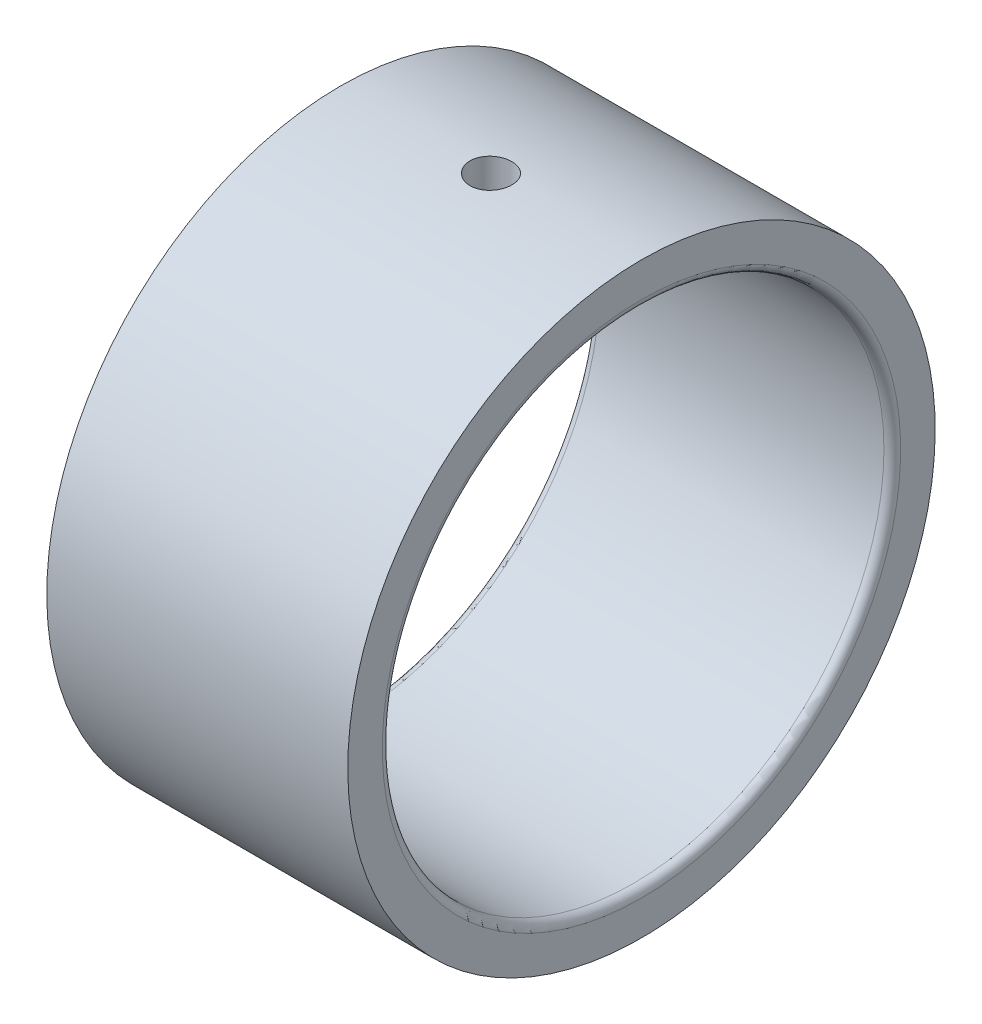
ISO-10303-21;
HEADER;
FILE_DESCRIPTION(('STEP AP214'),'2;1');
FILE_NAME('part.step','',(''),(''),'','','');
FILE_SCHEMA(('AUTOMOTIVE_DESIGN { 1 0 10303 214 1 1 1 1 }'));
ENDSEC;
DATA;
#1=APPLICATION_CONTEXT('core data for automotive mechanical design processes');
#2=APPLICATION_PROTOCOL_DEFINITION('international standard','automotive_design',2000,#1);
#3=PRODUCT_CONTEXT('',#1,'mechanical');
#4=PRODUCT('Part','Part','',(#3));
#5=PRODUCT_RELATED_PRODUCT_CATEGORY('part','',(#4));
#6=PRODUCT_DEFINITION_FORMATION('','',#4);
#7=PRODUCT_DEFINITION_CONTEXT('part definition',#1,'design');
#8=PRODUCT_DEFINITION('design','',#6,#7);
#9=PRODUCT_DEFINITION_SHAPE('','',#8);
#10=(LENGTH_UNIT() NAMED_UNIT(*) SI_UNIT(.MILLI.,.METRE.));
#11=(NAMED_UNIT(*) PLANE_ANGLE_UNIT() SI_UNIT($,.RADIAN.));
#12=(NAMED_UNIT(*) SI_UNIT($,.STERADIAN.) SOLID_ANGLE_UNIT());
#13=UNCERTAINTY_MEASURE_WITH_UNIT(LENGTH_MEASURE(1.E-05),#10,'distance_accuracy_value','');
#14=(GEOMETRIC_REPRESENTATION_CONTEXT(3) GLOBAL_UNCERTAINTY_ASSIGNED_CONTEXT((#13)) GLOBAL_UNIT_ASSIGNED_CONTEXT((#10,
#11,#12)) REPRESENTATION_CONTEXT('',''));
#15=CARTESIAN_POINT('',(0.,0.,0.));
#16=DIRECTION('',(0.,0.,1.));
#17=DIRECTION('',(1.,0.,0.));
#18=AXIS2_PLACEMENT_3D('',#15,#16,#17);
#19=CARTESIAN_POINT('',(23.,16.5325,0.));
#20=DIRECTION('',(1.,0.,0.));
#21=DIRECTION('',(0.,1.,0.));
#22=AXIS2_PLACEMENT_3D('',#19,#20,#21);
#23=PLANE('',#22);
#24=CARTESIAN_POINT('',(23.,0.,0.));
#25=DIRECTION('',(1.,0.,0.));
#26=DIRECTION('',(0.,1.,0.));
#27=AXIS2_PLACEMENT_3D('',#24,#25,#26);
#28=CIRCLE('',#27,17.565);
#29=CARTESIAN_POINT('',(23.,17.565,0.));
#30=VERTEX_POINT('',#29);
#31=EDGE_CURVE('E11',#30,#30,#28,.T.);
#32=ORIENTED_EDGE('',*,*,#31,.T.);
#33=EDGE_LOOP('',(#32));
#34=FACE_BOUND('',#33,.T.);
#35=CARTESIAN_POINT('',(23.,0.,0.));
#36=DIRECTION('',(1.,0.,0.));
#37=DIRECTION('',(0.,1.,0.));
#38=AXIS2_PLACEMENT_3D('',#35,#36,#37);
#39=CIRCLE('',#38,15.5);
#40=CARTESIAN_POINT('',(23.,15.5,0.));
#41=VERTEX_POINT('',#40);
#42=EDGE_CURVE('E58',#41,#41,#39,.T.);
#43=ORIENTED_EDGE('',*,*,#42,.F.);
#44=EDGE_LOOP('',(#43));
#45=FACE_BOUND('',#44,.T.);
#46=ADVANCED_FACE('F17',(#34,#45),#23,.T.);
#47=CARTESIAN_POINT('',(14.,0.,0.));
#48=DIRECTION('',(-1.,0.,0.));
#49=DIRECTION('',(0.,1.,0.));
#50=AXIS2_PLACEMENT_3D('',#47,#48,#49);
#51=CYLINDRICAL_SURFACE('',#50,17.565);
#52=CARTESIAN_POINT('',(5.,0.,0.));
#53=DIRECTION('',(1.,0.,0.));
#54=DIRECTION('',(0.,1.,0.));
#55=AXIS2_PLACEMENT_3D('',#52,#53,#54);
#56=CIRCLE('',#55,17.565);
#57=CARTESIAN_POINT('',(5.,17.565,0.));
#58=VERTEX_POINT('',#57);
#59=EDGE_CURVE('E30',#58,#58,#56,.T.);
#60=ORIENTED_EDGE('',*,*,#59,.T.);
#61=EDGE_LOOP('',(#60));
#62=FACE_BOUND('',#61,.T.);
#63=ORIENTED_EDGE('',*,*,#31,.F.);
#64=EDGE_LOOP('',(#63));
#65=FACE_BOUND('',#64,.T.);
#66=CARTESIAN_POINT('',(14.,17.5204658899243,1.24999999999996));
#67=CARTESIAN_POINT('',(13.9800089146342,17.520466301846,1.249993015171));
#68=CARTESIAN_POINT('',(13.9600187753889,17.5205022222585,1.24949071877739));
#69=CARTESIAN_POINT('',(13.9200070072349,17.5206435497487,1.24750807806131));
#70=CARTESIAN_POINT('',(13.8999855722453,17.5207492342176,1.24602382931405));
#71=CARTESIAN_POINT('',(13.8599113937337,17.5210294170264,1.2420776466169));
#72=CARTESIAN_POINT('',(13.8398592619771,17.5212043490581,1.23960955021257));
#73=CARTESIAN_POINT('',(13.7997233084123,17.5216215606517,1.23369840935388));
#74=CARTESIAN_POINT('',(13.7796407112833,17.5218644093639,1.23024712086131));
#75=CARTESIAN_POINT('',(13.739062522209,17.5224208541123,1.22229653610312));
#76=CARTESIAN_POINT('',(13.7185724710935,17.5227363437584,1.2177690591333));
#77=CARTESIAN_POINT('',(13.6780218017482,17.5234296476709,1.20775135998248));
#78=CARTESIAN_POINT('',(13.6579589886251,17.5238068864202,1.20227000093838));
#79=CARTESIAN_POINT('',(13.6182628873823,17.5246208298438,1.19034668784258));
#80=CARTESIAN_POINT('',(13.5986276635403,17.525057135288,1.18391115735987));
#81=CARTESIAN_POINT('',(13.5597862357427,17.5259858674348,1.17008213534265));
#82=CARTESIAN_POINT('',(13.5405786410135,17.526478065106,1.16269253739206));
#83=CARTESIAN_POINT('',(13.5025819532017,17.5275151689108,1.14695209969282));
#84=CARTESIAN_POINT('',(13.4837925194683,17.5280600300527,1.13860207931536));
#85=CARTESIAN_POINT('',(13.4465749671596,17.5291993963804,1.12092475371521));
#86=CARTESIAN_POINT('',(13.4281489059477,17.5297941182098,1.11159313349693));
#87=CARTESIAN_POINT('',(13.3916566091563,17.5310284000238,1.0919549938721));
#88=CARTESIAN_POINT('',(13.3735938588682,17.5316682484772,1.0816420208227));
#89=CARTESIAN_POINT('',(13.3378268938344,17.5329875438803,1.06004287022596));
#90=CARTESIAN_POINT('',(13.3201277224469,17.533667309547,1.04874837011251));
#91=CARTESIAN_POINT('',(13.2857941020258,17.5350326096038,1.02566385640195));
#92=CARTESIAN_POINT('',(13.2691436662075,17.5357174107756,1.01389756469167));
#93=CARTESIAN_POINT('',(13.2365764982019,17.5371001081785,0.989692037974546));
#94=CARTESIAN_POINT('',(13.2206544286263,17.5377978261774,0.977259982887079));
#95=CARTESIAN_POINT('',(13.1895435133486,17.5392020214601,0.951724645624603));
#96=CARTESIAN_POINT('',(13.1743503326084,17.5399084038689,0.938626642520315));
#97=CARTESIAN_POINT('',(13.1446957462063,17.5413253827599,0.911761428102619));
#98=CARTESIAN_POINT('',(13.1302312732844,17.5420359445002,0.897997602473691));
#99=CARTESIAN_POINT('',(13.1020125424039,17.5434576665171,0.869780118696981));
#100=CARTESIAN_POINT('',(13.0882577792327,17.5441688259912,0.855326965760072));
#101=CARTESIAN_POINT('',(13.0614044838503,17.545588793772,0.825687665915485));
#102=CARTESIAN_POINT('',(13.0483096926966,17.546297571149,0.810498129870093));
#103=CARTESIAN_POINT('',(13.0227743265952,17.5477071013984,0.779387418373633));
#104=CARTESIAN_POINT('',(13.0103393915431,17.5484077542909,0.763461611997861));
#105=CARTESIAN_POINT('',(12.9861213573174,17.5497950944619,0.730879986145946));
#106=CARTESIAN_POINT('',(12.9743457930942,17.5504815790485,0.714218564183063));
#107=CARTESIAN_POINT('',(12.9512598341399,17.5518455897751,0.679886012734962));
#108=CARTESIAN_POINT('',(12.9399720291957,17.5525223128224,0.662199652814072));
#109=CARTESIAN_POINT('',(12.9183815009633,17.5538344170415,0.626449711092376));
#110=CARTESIAN_POINT('',(12.9080708557196,17.5544701143763,0.608390930709203));
#111=CARTESIAN_POINT('',(12.8884324143112,17.5556967493197,0.571898363546964));
#112=CARTESIAN_POINT('',(12.879098588526,17.5562879543055,0.553467832620349));
#113=CARTESIAN_POINT('',(12.8614115616356,17.5574221785125,0.516233394130617));
#114=CARTESIAN_POINT('',(12.8530544826761,17.5579653860375,0.497431335469938));
#115=CARTESIAN_POINT('',(12.8373116760529,17.5590007198477,0.459434129595488));
#116=CARTESIAN_POINT('',(12.8299254804073,17.5594928707188,0.440239176958119));
#117=CARTESIAN_POINT('',(12.8161007823937,17.5604234024573,0.401414535858721));
#118=CARTESIAN_POINT('',(12.8096665999717,17.5608615368014,0.381783304311059));
#119=CARTESIAN_POINT('',(12.7977429179005,17.5616798241945,0.342087101088755));
#120=CARTESIAN_POINT('',(12.792260254934,17.562059555567,0.322020069355993));
#121=CARTESIAN_POINT('',(12.7822373766536,17.5627567486462,0.281452904589832));
#122=CARTESIAN_POINT('',(12.7777064208934,17.5630735970349,0.260950478139567));
#123=CARTESIAN_POINT('',(12.7697451193843,17.5636294234586,0.22033451523269));
#124=CARTESIAN_POINT('',(12.7662872555337,17.5638703514381,0.200226393044502));
#125=CARTESIAN_POINT('',(12.7603679452518,17.5642821275545,0.160056065129138));
#126=CARTESIAN_POINT('',(12.7578974278249,17.564453613872,0.139995208183642));
#127=CARTESIAN_POINT('',(12.7539511149658,17.5647271394141,0.0999206600752436));
#128=CARTESIAN_POINT('',(12.7524683017481,17.5648296686409,0.079907665211727));
#129=CARTESIAN_POINT('',(12.7504950747756,17.5649659333044,0.0399296208034422));
#130=CARTESIAN_POINT('',(12.7499998824952,17.5649999999978,0.0199648095195712));
#131=CARTESIAN_POINT('',(12.7500001174694,17.5650000000022,-0.0199588018962388));
#132=CARTESIAN_POINT('',(12.7504952466809,17.5649659538122,-0.0399176020292395));
#133=CARTESIAN_POINT('',(12.7524683281529,17.5648297574541,-0.0798876360126819));
#134=CARTESIAN_POINT('',(12.7539512567502,17.5647272624479,-0.0998986217190281));
#135=CARTESIAN_POINT('',(12.7578976770498,17.564453792032,-0.139973143296073));
#136=CARTESIAN_POINT('',(12.7603683768427,17.5642823131658,-0.160035963793074));
#137=CARTESIAN_POINT('',(12.7662873905096,17.5638704956513,-0.200214336519088));
#138=CARTESIAN_POINT('',(12.7697449493132,17.5636295055822,-0.220328514510191));
#139=CARTESIAN_POINT('',(12.7777030539385,17.5630737598698,-0.260938578970886));
#140=CARTESIAN_POINT('',(12.7822302802459,17.562757114416,-0.281429218173477));
#141=CARTESIAN_POINT('',(12.7922481376375,17.5620602732342,-0.321980689153653));
#142=CARTESIAN_POINT('',(12.7977298901683,17.5616806645832,-0.342043719709662));
#143=CARTESIAN_POINT('',(12.8096537468708,17.5608624855571,-0.381739868853653));
#144=CARTESIAN_POINT('',(12.8160894085632,17.5604243125261,-0.40137492903844));
#145=CARTESIAN_POINT('',(12.8299184207387,17.5594934775066,-0.440215486387578));
#146=CARTESIAN_POINT('',(12.8373078477928,17.559001039893,-0.459422384860624));
#147=CARTESIAN_POINT('',(12.8530488825843,17.5579656861014,-0.4974203219267));
#148=CARTESIAN_POINT('',(12.8613997998414,17.5574228062012,-0.516211647538775));
#149=CARTESIAN_POINT('',(12.8790786188817,17.5562890871765,-0.553431786612573));
#150=CARTESIAN_POINT('',(12.8884107787566,17.5556980417594,-0.571858570080041));
#151=CARTESIAN_POINT('',(12.9080493968001,17.5544715003397,-0.608351047569516));
#152=CARTESIAN_POINT('',(12.918362246682,17.5538357209052,-0.626413289815878));
#153=CARTESIAN_POINT('',(12.9399602726176,17.5525231438912,-0.662177912198753));
#154=CARTESIAN_POINT('',(12.9512537054419,17.551846015868,-0.679875288324914));
#155=CARTESIAN_POINT('',(12.9743383743283,17.5504819552277,-0.714209095182545));
#156=CARTESIAN_POINT('',(12.9861060680005,17.5497958597567,-0.730861396020406));
#157=CARTESIAN_POINT('',(13.0103136223668,17.5484090894612,-0.763430866135088));
#158=CARTESIAN_POINT('',(13.0227462436235,17.5477086086603,-0.779353417768006));
#159=CARTESIAN_POINT('',(13.0482817566078,17.5462991498696,-0.810464010784431));
#160=CARTESIAN_POINT('',(13.061379309318,17.5455902665067,-0.825656436467267));
#161=CARTESIAN_POINT('',(13.0882424907588,17.5441697395448,-0.855308382492613));
#162=CARTESIAN_POINT('',(13.1020046742961,17.5434581247677,-0.869771023746323));
#163=CARTESIAN_POINT('',(13.1302221767156,17.5420363409971,-0.897989732908215));
#164=CARTESIAN_POINT('',(13.1446771596884,17.5413261714735,-0.911746136672221));
#165=CARTESIAN_POINT('',(13.1743191000033,17.5399097497178,-0.938601464868672));
#166=CARTESIAN_POINT('',(13.1895093928041,17.5392035355236,-0.951696707836842));
#167=CARTESIAN_POINT('',(13.2206204299002,17.537799392767,-0.977231900959588));
#168=CARTESIAN_POINT('',(13.2365457558611,17.5371015644926,-0.989666271164133));
#169=CARTESIAN_POINT('',(13.2691250795189,17.5357182997025,-1.01388227790413));
#170=CARTESIAN_POINT('',(13.2857846347206,17.5350330482933,-1.02565643891281));
#171=CARTESIAN_POINT('',(13.3201169956888,17.5336676721139,-1.04874223995048));
#172=CARTESIAN_POINT('',(13.3378051486998,17.532988250975,-1.06003111079908));
#173=CARTESIAN_POINT('',(13.373557432598,17.531669435822,-1.0816227631636));
#174=CARTESIAN_POINT('',(13.3916167226445,17.5310297356258,-1.09193353244419));
#175=CARTESIAN_POINT('',(13.4281091125009,17.529795491231,-1.1115714972713));
#176=CARTESIAN_POINT('',(13.4465389229626,17.5292006747425,-1.12090478434916));
#177=CARTESIAN_POINT('',(13.4837707751675,17.5280607967688,-1.13859031839306));
#178=CARTESIAN_POINT('',(13.5025709406967,17.5275155378474,-1.14694650007027));
#179=CARTESIAN_POINT('',(13.5405668949237,17.5264783173799,-1.16268870871728));
#180=CARTESIAN_POINT('',(13.5597625425983,17.5259863372139,-1.170075074812));
#181=CARTESIAN_POINT('',(13.5985880544976,17.5250579035839,-1.18389978288564));
#182=CARTESIAN_POINT('',(13.6182194512878,17.52462170253,-1.19033383479579));
#183=CARTESIAN_POINT('',(13.6579156087655,17.5238077804959,-1.20225697332903));
#184=CARTESIAN_POINT('',(13.6779824236363,17.5234304832498,-1.20773924211751));
#185=CARTESIAN_POINT('',(13.7185487876742,17.5227368378369,-1.21776196484662));
#186=CARTESIAN_POINT('',(13.7390506263045,17.5224210898321,-1.22229317495197));
#187=CARTESIAN_POINT('',(13.77963470834,17.521864421253,-1.23024694433581));
#188=CARTESIAN_POINT('',(13.7997112439371,17.5216215508487,-1.23369852304446));
#189=CARTESIAN_POINT('',(13.8398391693481,17.5212043199215,-1.23960998801517));
#190=CARTESIAN_POINT('',(13.8598893599279,17.521029402322,-1.24207794255419));
#191=CARTESIAN_POINT('',(13.899963505796,17.5207492226495,-1.24602390395184));
#192=CARTESIAN_POINT('',(13.9199868690026,17.5206435403209,-1.24750788417871));
#193=CARTESIAN_POINT('',(13.9600068677542,17.5205022185822,-1.24949109525479));
#194=CARTESIAN_POINT('',(13.9800033177053,17.5204663156298,-1.24999403133116));
#195=CARTESIAN_POINT('',(14.0199247421255,17.5204654657503,-1.25000594719611));
#196=CARTESIAN_POINT('',(14.0398497149258,17.520500264016,-1.24951849633765));
#197=CARTESIAN_POINT('',(14.0797744850562,17.5206401617727,-1.24755532316586));
#198=CARTESIAN_POINT('',(14.0997739783732,17.5207456966074,-1.2460734808653));
#199=CARTESIAN_POINT('',(14.1398481977649,17.5210259601027,-1.24212650289831));
#200=CARTESIAN_POINT('',(14.1599220957016,17.5212012750152,-1.2396530348589));
#201=CARTESIAN_POINT('',(14.2001457189041,17.5216196498218,-1.23372555122565));
#202=CARTESIAN_POINT('',(14.2202939063651,17.521863423645,-1.23026119462141));
#203=CARTESIAN_POINT('',(14.2609372383137,17.5224209423229,-1.22229528637929));
#204=CARTESIAN_POINT('',(14.2814274650319,17.522736367292,-1.21776872572151));
#205=CARTESIAN_POINT('',(14.3219782616054,17.5234296243463,-1.20775169043216));
#206=CARTESIAN_POINT('',(14.34204102832,17.5238068801905,-1.20227008919656));
#207=CARTESIAN_POINT('',(14.381737095842,17.5246208360347,-1.1903466001331));
#208=CARTESIAN_POINT('',(14.4013723319923,17.5250571369442,-1.18391113389543));
#209=CARTESIAN_POINT('',(14.4402137687507,17.5259858657861,-1.1700821586994));
#210=CARTESIAN_POINT('',(14.459421360194,17.5264780646645,-1.16269254364759));
#211=CARTESIAN_POINT('',(14.4974180456044,17.5275151693523,-1.1469520934373));
#212=CARTESIAN_POINT('',(14.5162074802183,17.5280600301716,-1.13860207763103));
#213=CARTESIAN_POINT('',(14.5534250331778,17.5291993962618,-1.12092475539436));
#214=CARTESIAN_POINT('',(14.5718510941548,17.5297941181783,-1.11159313394187));
#215=CARTESIAN_POINT('',(14.6083433907717,17.5310284000566,-1.09195499340653));
#216=CARTESIAN_POINT('',(14.6264061411225,17.5316682484864,-1.08164202069209));
#217=CARTESIAN_POINT('',(14.6621731061979,17.5329875438718,-1.06004287034528));
#218=CARTESIAN_POINT('',(14.6798722775636,17.5336673095449,-1.0487483701429));
#219=CARTESIAN_POINT('',(14.7142058979727,17.5350326096063,-1.02566385636691));
#220=CARTESIAN_POINT('',(14.7308563337997,17.5357174107766,-1.0138975646764));
#221=CARTESIAN_POINT('',(14.7634235018145,17.5371001081786,-0.98969203797142));
#222=CARTESIAN_POINT('',(14.7793455713904,17.537797826178,-0.977259982876728));
#223=CARTESIAN_POINT('',(14.8104564866673,17.5392020214609,-0.951724645609818));
#224=CARTESIAN_POINT('',(14.8256496674065,17.5399084038696,-0.938626642508405));
#225=CARTESIAN_POINT('',(14.8553042538027,17.5413253827602,-0.911761428096319));
#226=CARTESIAN_POINT('',(14.86976872672,17.5420359445004,-0.897997602470273));
#227=CARTESIAN_POINT('',(14.8979874575997,17.5434576665173,-0.869780118692287));
#228=CARTESIAN_POINT('',(14.9117422207744,17.5441688259917,-0.855326965750821));
#229=CARTESIAN_POINT('',(14.9385955161615,17.5455887937728,-0.825687665900112));
#230=CARTESIAN_POINT('',(14.9516903073164,17.5462975711498,-0.810498129853283));
#231=CARTESIAN_POINT('',(14.9772256734179,17.5477071013991,-0.779387418356844));
#232=CARTESIAN_POINT('',(14.9896606084689,17.5484077542916,-0.763461611982648));
#233=CARTESIAN_POINT('',(15.0138786426898,17.5497950944623,-0.730879986136753));
#234=CARTESIAN_POINT('',(15.0256542069093,17.5504815790487,-0.714218564178422));
#235=CARTESIAN_POINT('',(15.0487401658587,17.5518455897751,-0.679886012736097));
#236=CARTESIAN_POINT('',(15.0600279708016,17.5525223128223,-0.66219965281632));
#237=CARTESIAN_POINT('',(15.0816184990321,17.5538344170413,-0.626449711096166));
#238=CARTESIAN_POINT('',(15.0919291442754,17.5544701143762,-0.608390930713389));
#239=CARTESIAN_POINT('',(15.1115675856837,17.5556967493195,-0.571898363551144));
#240=CARTESIAN_POINT('',(15.1209014114693,17.5562879543054,-0.553467832624101));
#241=CARTESIAN_POINT('',(15.1385884383616,17.5574221785124,-0.516233394132873));
#242=CARTESIAN_POINT('',(15.1469455173226,17.5579653860375,-0.497431335471102));
#243=CARTESIAN_POINT('',(15.1626883239451,17.5590007198475,-0.459434129602148));
#244=CARTESIAN_POINT('',(15.1700745195889,17.5594928707184,-0.440239176971535));
#245=CARTESIAN_POINT('',(15.1838992176,17.5604234024567,-0.401414535881153));
#246=CARTESIAN_POINT('',(15.1903334000212,17.5608615368008,-0.381783304335673));
#247=CARTESIAN_POINT('',(15.2022570820923,17.561679824194,-0.342087101113343));
#248=CARTESIAN_POINT('',(15.2077397450593,17.5620595555666,-0.322020069378306));
#249=CARTESIAN_POINT('',(15.2177626233425,17.562756748646,-0.281452904603234));
#250=CARTESIAN_POINT('',(15.2222935791048,17.5630735970348,-0.260950478146278));
#251=CARTESIAN_POINT('',(15.2302548806156,17.5636294234586,-0.220334515235786));
#252=CARTESIAN_POINT('',(15.2337127444664,17.563870351438,-0.200226393050764));
#253=CARTESIAN_POINT('',(15.2396320547484,17.5642821275544,-0.160056065139615));
#254=CARTESIAN_POINT('',(15.2421025721752,17.5644536138719,-0.139995208195154));
#255=CARTESIAN_POINT('',(15.2460488850343,17.564727139414,-0.0999206600867824));
#256=CARTESIAN_POINT('',(15.2475316982519,17.5648296686408,-0.0799076652222485));
#257=CARTESIAN_POINT('',(15.2495049252244,17.5649659333043,-0.0399296208098309));
#258=CARTESIAN_POINT('',(15.2500001175048,17.5649999999978,-0.0199648095228393));
#259=CARTESIAN_POINT('',(15.2499998825306,17.5650000000022,0.019958801899784));
#260=CARTESIAN_POINT('',(15.2495047533192,17.5649659538121,0.0399176020364772));
#261=CARTESIAN_POINT('',(15.2475316718471,17.5648297574541,0.0798876360248588));
#262=CARTESIAN_POINT('',(15.2460487432499,17.5647272624478,0.0998986217324575));
#263=CARTESIAN_POINT('',(15.2421023229503,17.5644537920319,0.139973143309554));
#264=CARTESIAN_POINT('',(15.2396316231576,17.5642823131657,0.160035963805366));
#265=CARTESIAN_POINT('',(15.2337126094905,17.5638704956512,0.200214336526486));
#266=CARTESIAN_POINT('',(15.2302550506867,17.5636295055822,0.220328514513899));
#267=CARTESIAN_POINT('',(15.2222969460598,17.5630737598697,0.260938578976082));
#268=CARTESIAN_POINT('',(15.2177697197505,17.5627571144159,0.281429218183766));
#269=CARTESIAN_POINT('',(15.2077518623565,17.5620602732339,0.321980689170715));
#270=CARTESIAN_POINT('',(15.2022701098252,17.5616806645829,0.342043719728446));
#271=CARTESIAN_POINT('',(15.1903462531228,17.5608624855567,0.381739868872447));
#272=CARTESIAN_POINT('',(15.1839105914311,17.5604243125257,0.401374929055574));
#273=CARTESIAN_POINT('',(15.1700815792578,17.5594934775064,0.440215486397875));
#274=CARTESIAN_POINT('',(15.1626921522054,17.5590010398929,0.459422384865808));
#275=CARTESIAN_POINT('',(15.1469511174163,17.5579656861014,0.497420321924219));
#276=CARTESIAN_POINT('',(15.1386002001598,17.5574228062013,0.516211647533688));
#277=CARTESIAN_POINT('',(15.1209213811204,17.5562890871767,0.553431786604063));
#278=CARTESIAN_POINT('',(15.1115892212457,17.5556980417597,0.571858570070675));
#279=CARTESIAN_POINT('',(15.0919506032021,17.5544715003401,0.608351047560133));
#280=CARTESIAN_POINT('',(15.08163775332,17.5538357209055,0.626413289807291));
#281=CARTESIAN_POINT('',(15.0600397273836,17.5525231438914,0.662177912193618));
#282=CARTESIAN_POINT('',(15.0487462945588,17.5518460158681,0.679875288322396));
#283=CARTESIAN_POINT('',(15.0256616256736,17.5504819552278,0.714209095181179));
#284=CARTESIAN_POINT('',(15.0138939320036,17.5497958597568,0.730861396017702));
#285=CARTESIAN_POINT('',(14.98968637764,17.5484090894614,0.763430866130535));
#286=CARTESIAN_POINT('',(14.9772537563838,17.5477086086605,0.779353417762905));
#287=CARTESIAN_POINT('',(14.9517182433995,17.5462991498698,0.810464010779312));
#288=CARTESIAN_POINT('',(14.9386206906886,17.5455902665069,0.825656436462632));
#289=CARTESIAN_POINT('',(14.9117575092452,17.5441697395449,0.855308382489725));
#290=CARTESIAN_POINT('',(14.8979953257058,17.5434581247678,0.869771023744646));
#291=CARTESIAN_POINT('',(14.8697778232813,17.542036340997,0.897989732910864));
#292=CARTESIAN_POINT('',(14.8553228403053,17.5413261714732,0.911746136677924));
#293=CARTESIAN_POINT('',(14.825680899986,17.5399097497174,0.938601464876662));
#294=CARTESIAN_POINT('',(14.8104906071838,17.5392035355233,0.951696707844156));
#295=CARTESIAN_POINT('',(14.7793795700886,17.5377993927663,0.977231900971373));
#296=CARTESIAN_POINT('',(14.76345424413,17.5371015644915,0.989666271181225));
#297=CARTESIAN_POINT('',(14.7308749204732,17.5357182997028,1.01388227790088));
#298=CARTESIAN_POINT('',(14.7142153652702,17.5350330482954,1.02565643888374));
#299=CARTESIAN_POINT('',(14.6798830043106,17.5336676721114,1.04874223998693));
#300=CARTESIAN_POINT('',(14.6621948513098,17.532988250966,1.06003111092955));
#301=CARTESIAN_POINT('',(14.6264425673561,17.5316694358297,1.08162276305598));
#302=CARTESIAN_POINT('',(14.6083832772449,17.5310297356564,1.09193353200847));
#303=CARTESIAN_POINT('',(14.5718908875591,17.5297954911988,1.11157149773428));
#304=CARTESIAN_POINT('',(14.5534610773309,17.5292006746254,1.1209047860288));
#305=CARTESIAN_POINT('',(14.5162292245041,17.528060796884,1.13859031674276));
#306=CARTESIAN_POINT('',(14.497429058124,17.5275155382782,1.14694649389766));
#307=CARTESIAN_POINT('',(14.4594331062494,17.526478316949,1.16268871489024));
#308=CARTESIAN_POINT('',(14.4402374617764,17.5259863356063,1.17007509784506));
#309=CARTESIAN_POINT('',(14.4014119411139,17.5250579051992,1.18389975974194));
#310=CARTESIAN_POINT('',(14.3817805322923,17.5246217085693,1.19033374826522));
#311=CARTESIAN_POINT('',(14.3420844077751,17.523807774416,1.20225706044252));
#312=CARTESIAN_POINT('',(14.3220176382895,17.5234304604819,1.20773956833525));
#313=CARTESIAN_POINT('',(14.2814511498289,17.5227368608174,1.2177616355815));
#314=CARTESIAN_POINT('',(14.2609491393831,17.522421175987,1.22229194052392));
#315=CARTESIAN_POINT('',(14.2202999035013,17.5218634373714,1.23026100553438));
#316=CARTESIAN_POINT('',(14.2001577627921,17.5216196471619,1.23372561325674));
#317=CARTESIAN_POINT('',(14.1599422078175,17.5212012367275,1.23965355322462));
#318=CARTESIAN_POINT('',(14.1398703057418,17.5210259147239,1.24212705126935));
#319=CARTESIAN_POINT('',(14.0997959696174,17.5207457125264,1.24607334662653));
#320=CARTESIAN_POINT('',(14.0797943458768,17.5206402586846,1.24755429439939));
#321=CARTESIAN_POINT('',(14.0398618969997,17.520500152507,1.2495197319216));
#322=CARTESIAN_POINT('',(14.0199313625287,17.5204650810555,1.25001012040509));
#323=CARTESIAN_POINT('',(14.,17.5204658899243,1.24999999999996));
#324=B_SPLINE_CURVE_WITH_KNOTS('',3,(#66,#67,#68,#69,#70,#71,#72,#73,#74,#75,#76,#77,#78,#79,
#80,#81,#82,#83,#84,#85,#86,#87,#88,#89,#90,#91,#92,#93,#94,#95,#96,#97,#98,#99,#100,#101,#102,
#103,#104,#105,#106,#107,#108,#109,#110,#111,#112,#113,#114,#115,#116,#117,#118,#119,#120,#121,
#122,#123,#124,#125,#126,#127,#128,#129,#130,#131,#132,#133,#134,#135,#136,#137,#138,#139,#140,
#141,#142,#143,#144,#145,#146,#147,#148,#149,#150,#151,#152,#153,#154,#155,#156,#157,#158,#159,
#160,#161,#162,#163,#164,#165,#166,#167,#168,#169,#170,#171,#172,#173,#174,#175,#176,#177,#178,
#179,#180,#181,#182,#183,#184,#185,#186,#187,#188,#189,#190,#191,#192,#193,#194,#195,#196,#197,
#198,#199,#200,#201,#202,#203,#204,#205,#206,#207,#208,#209,#210,#211,#212,#213,#214,#215,#216,
#217,#218,#219,#220,#221,#222,#223,#224,#225,#226,#227,#228,#229,#230,#231,#232,#233,#234,#235,
#236,#237,#238,#239,#240,#241,#242,#243,#244,#245,#246,#247,#248,#249,#250,#251,#252,#253,#254,
#255,#256,#257,#258,#259,#260,#261,#262,#263,#264,#265,#266,#267,#268,#269,#270,#271,#272,#273,
#274,#275,#276,#277,#278,#279,#280,#281,#282,#283,#284,#285,#286,#287,#288,#289,#290,#291,#292,
#293,#294,#295,#296,#297,#298,#299,#300,#301,#302,#303,#304,#305,#306,#307,#308,#309,#310,#311,
#312,#313,#314,#315,#316,#317,#318,#319,#320,#321,#322,#323),.UNSPECIFIED.,.F.,.F.,(4,2,2,2,2,2,
2,2,2,2,2,2,2,2,2,2,2,2,2,2,2,2,2,2,2,2,2,2,2,2,2,2,2,2,2,2,2,2,2,2,2,2,2,2,2,2,2,2,2,2,2,2,2,2,
2,2,2,2,2,2,2,2,2,2,2,2,2,2,2,2,2,2,2,2,2,2,2,2,2,2,2,2,2,2,2,2,2,2,2,2,2,2,2,2,2,2,2,2,2,2,2,2,
2,2,2,2,2,2,2,2,2,2,2,2,2,2,2,2,2,2,2,2,2,2,2,2,2,2,4),(0.,0.059965998379301,0.120171877363313,
0.180760942894221,0.241873805318166,0.304808916148259,0.367187761058506,0.429164280990093,
0.490895426807696,0.55257429280864,0.61453661937885,0.676939045118618,0.739934925769114,
0.801111966725258,0.861726664406241,0.921919117561016,0.981832387073532,1.0417024011528,
1.10188049497556,1.16250969047629,1.22372984806673,1.28668224173776,1.34907043502638,
1.41104745940872,1.47276940475099,1.53446148912053,1.59642545108307,1.65881768621844,
1.72179139932382,1.78298298353436,1.84359869613337,1.90377899563756,1.96366740421358,
2.02353779173063,2.08371209874324,2.14433377529837,2.20554312616203,2.26847986863158,
2.3308597513638,2.39283606449945,2.45456510478114,2.51625008853452,2.57821475986983,
2.64061530744977,2.70360467762331,2.7647888289295,2.82540599439867,2.88559611869758,
2.94550213938849,3.00537940235178,3.06555982503909,3.12618655273397,3.18739959979411,
3.25035850192347,3.31274857263478,3.37472325297389,3.43643908239778,3.49813327323808,
3.56009744217894,3.62248863930986,3.6854607198443,3.74655581699968,3.80713891896814,
3.8673507900076,3.92733480793966,3.98710302705395,4.04724250536154,4.10789828200031,
4.16921173224334,4.23214684309934,4.29452568801826,4.35650220794118,4.41823335373277,
4.47991221974825,4.54187454632331,4.60427697205819,4.66727285269406,4.72844989366708,
4.78906459135371,4.8492570445029,4.90917031399865,4.96904032809526,5.02921842192381,
5.08984761741875,5.1510677749918,5.21402016865769,5.27640836194465,5.33838538632864,
5.40010733167576,5.46179941602437,5.52376337797992,5.58615561312229,5.64912932624861,
5.71032091044986,5.77093662304573,5.83111692255296,5.89100533113833,5.95087571866645,
6.0110500256828,6.07167170223432,6.13288105308714,6.19581779557283,6.25819767831042,
6.3201739914407,6.38190303170617,6.44358801545174,6.50555268678449,6.56795323436698,
6.63094260454803,6.69212675584734,6.75274392131414,6.81293404561536,6.87284006631337,
6.932717329289,6.99289775198044,7.05352447967119,7.11473752671899,7.17769642887231,
7.24008649959161,7.30206117992279,7.36377700932295,7.42547120015843,7.48743536909774,
7.54982656623012,7.61279864676875,7.67409433540352,7.73474414943585,7.79488961920929,
7.85467585694477),.UNSPECIFIED.);
#325=CARTESIAN_POINT('',(14.,17.5204658899243,1.25));
#326=VERTEX_POINT('',#325);
#327=EDGE_CURVE('E114',#326,#326,#324,.T.);
#328=ORIENTED_EDGE('',*,*,#327,.T.);
#329=EDGE_LOOP('',(#328));
#330=FACE_BOUND('',#329,.T.);
#331=ADVANCED_FACE('F100',(#62,#65,#330),#51,.T.);
#332=CARTESIAN_POINT('',(5.,16.5325,0.));
#333=DIRECTION('',(-1.,0.,0.));
#334=DIRECTION('',(0.,-1.,0.));
#335=AXIS2_PLACEMENT_3D('',#332,#333,#334);
#336=PLANE('',#335);
#337=CARTESIAN_POINT('',(5.,0.,0.));
#338=DIRECTION('',(1.,0.,0.));
#339=DIRECTION('',(0.,1.,0.));
#340=AXIS2_PLACEMENT_3D('',#337,#338,#339);
#341=CIRCLE('',#340,15.5);
#342=CARTESIAN_POINT('',(5.,15.5,0.));
#343=VERTEX_POINT('',#342);
#344=EDGE_CURVE('E64',#343,#343,#341,.T.);
#345=ORIENTED_EDGE('',*,*,#344,.T.);
#346=EDGE_LOOP('',(#345));
#347=FACE_BOUND('',#346,.T.);
#348=ORIENTED_EDGE('',*,*,#59,.F.);
#349=EDGE_LOOP('',(#348));
#350=FACE_BOUND('',#349,.T.);
#351=ADVANCED_FACE('F103',(#347,#350),#336,.T.);
#352=CARTESIAN_POINT('',(5.5,0.,0.));
#353=DIRECTION('',(1.,0.,0.));
#354=DIRECTION('',(0.,0.,-1.));
#355=AXIS2_PLACEMENT_3D('',#352,#353,#354);
#356=TOROIDAL_SURFACE('',#355,15.5,0.5);
#357=CARTESIAN_POINT('',(5.5,0.,0.));
#358=DIRECTION('',(1.,0.,0.));
#359=DIRECTION('',(0.,1.,0.));
#360=AXIS2_PLACEMENT_3D('',#357,#358,#359);
#361=CIRCLE('',#360,15.);
#362=CARTESIAN_POINT('',(5.5,15.,0.));
#363=VERTEX_POINT('',#362);
#364=EDGE_CURVE('E54',#363,#363,#361,.T.);
#365=ORIENTED_EDGE('',*,*,#364,.T.);
#366=EDGE_LOOP('',(#365));
#367=FACE_BOUND('',#366,.T.);
#368=ORIENTED_EDGE('',*,*,#344,.F.);
#369=EDGE_LOOP('',(#368));
#370=FACE_BOUND('',#369,.T.);
#371=ADVANCED_FACE('F121',(#367,#370),#356,.T.);
#372=CARTESIAN_POINT('',(14.,0.,0.));
#373=DIRECTION('',(-1.,0.,0.));
#374=DIRECTION('',(0.,1.,0.));
#375=AXIS2_PLACEMENT_3D('',#372,#373,#374);
#376=CYLINDRICAL_SURFACE('',#375,15.);
#377=CARTESIAN_POINT('',(22.5,0.,0.));
#378=DIRECTION('',(1.,0.,0.));
#379=DIRECTION('',(0.,1.,0.));
#380=AXIS2_PLACEMENT_3D('',#377,#378,#379);
#381=CIRCLE('',#380,15.);
#382=CARTESIAN_POINT('',(22.5,15.,0.));
#383=VERTEX_POINT('',#382);
#384=EDGE_CURVE('E62',#383,#383,#381,.T.);
#385=ORIENTED_EDGE('',*,*,#384,.T.);
#386=EDGE_LOOP('',(#385));
#387=FACE_BOUND('',#386,.T.);
#388=ORIENTED_EDGE('',*,*,#364,.F.);
#389=EDGE_LOOP('',(#388));
#390=FACE_BOUND('',#389,.T.);
#391=CARTESIAN_POINT('',(14.,14.9478259288767,1.25000000000002));
#392=CARTESIAN_POINT('',(14.0199924748848,14.9478264114828,1.24999301513317));
#393=CARTESIAN_POINT('',(14.0399839979535,14.9478685231291,1.24949061310983));
#394=CARTESIAN_POINT('',(14.0799988846454,14.9480342060446,1.24750758759203));
#395=CARTESIAN_POINT('',(14.1000220528392,14.9481581043257,1.24602303706635));
#396=CARTESIAN_POINT('',(14.1401000472517,14.9484865714838,1.242076061781));
#397=CARTESIAN_POINT('',(14.1601542577852,14.9486916509251,1.23960744734704));
#398=CARTESIAN_POINT('',(14.2002947214351,14.9491807608323,1.23369505161425));
#399=CARTESIAN_POINT('',(14.2203797429083,14.9494654608654,1.23024299527902));
#400=CARTESIAN_POINT('',(14.2609604142341,14.9501177519367,1.22229114675793));
#401=CARTESIAN_POINT('',(14.2814505318713,14.9504875546409,1.21776326991143));
#402=CARTESIAN_POINT('',(14.3220015506616,14.9513001981413,1.20774475726851));
#403=CARTESIAN_POINT('',(14.342064642739,14.9517423668976,1.2022629531345));
#404=CARTESIAN_POINT('',(14.381761521872,14.9526963913755,1.19033867569855));
#405=CARTESIAN_POINT('',(14.4013972373996,14.953207781806,1.18390259140417));
#406=CARTESIAN_POINT('',(14.4402398657278,14.9542963305123,1.17007229641125));
#407=CARTESIAN_POINT('',(14.4594481582132,14.9548732229908,1.16268194233337));
#408=CARTESIAN_POINT('',(14.4974439695773,14.9560886897684,1.14694085232427));
#409=CARTESIAN_POINT('',(14.5162318667125,14.9567272056255,1.13859102492697));
#410=CARTESIAN_POINT('',(14.5534467927377,14.9580623903311,1.12091410476468));
#411=CARTESIAN_POINT('',(14.571871742732,14.9587593152597,1.11158265730547));
#412=CARTESIAN_POINT('',(14.608362259851,14.9602056888512,1.09194476198303));
#413=CARTESIAN_POINT('',(14.6264243173983,14.9609554772977,1.08163182253476));
#414=CARTESIAN_POINT('',(14.6621903434298,14.962501438759,1.0600325307331));
#415=CARTESIAN_POINT('',(14.6798892422844,14.9632979864814,1.04873782000995));
#416=CARTESIAN_POINT('',(14.7142203965555,14.9648977148121,1.02565418029105));
#417=CARTESIAN_POINT('',(14.7308686985245,14.9657000349005,1.01388904483009));
#418=CARTESIAN_POINT('',(14.7634320963707,14.9673199945758,0.989685742557751));
#419=CARTESIAN_POINT('',(14.779352510844,14.968137426565,0.977254726451015));
#420=CARTESIAN_POINT('',(14.8104606137362,14.9697825323831,0.951721307546996));
#421=CARTESIAN_POINT('',(14.8256526171877,14.9706100959024,0.938624157452573));
#422=CARTESIAN_POINT('',(14.8553053481272,14.9722701415207,0.911760421845823));
#423=CARTESIAN_POINT('',(14.8697691223956,14.9731025833903,0.897997198714839));
#424=CARTESIAN_POINT('',(14.8979859180828,14.974768090245,0.869781666254368));
#425=CARTESIAN_POINT('',(14.9117394760273,14.9756011542628,0.855329893434211));
#426=CARTESIAN_POINT('',(14.938590551817,14.9772644946931,0.82569343217483));
#427=CARTESIAN_POINT('',(14.9516843299791,14.9780947347073,0.810505355228374));
#428=CARTESIAN_POINT('',(14.9772178575727,14.9797457862162,0.779397577720448));
#429=CARTESIAN_POINT('',(14.9896519714019,14.9805664804538,0.763473247948671));
#430=CARTESIAN_POINT('',(15.0138685488429,14.982191485871,0.730894536621442));
#431=CARTESIAN_POINT('',(15.0256434847986,14.9829955595866,0.714234554600348));
#432=CARTESIAN_POINT('',(15.0487286484453,14.9845932130999,0.679904387562208));
#433=CARTESIAN_POINT('',(15.0600162806966,14.9853858512636,0.662218955797482));
#434=CARTESIAN_POINT('',(15.0816065573354,14.9869226806628,0.62647080309294));
#435=CARTESIAN_POINT('',(15.09191713529,14.9876672429724,0.608412895140134));
#436=CARTESIAN_POINT('',(15.1115555318875,14.9891039222824,0.57192202375011));
#437=CARTESIAN_POINT('',(15.1208893953293,14.9897963533771,0.553492327874264));
#438=CARTESIAN_POINT('',(15.1385765898475,14.9911247623497,0.516259539947574));
#439=CARTESIAN_POINT('',(15.1469338175387,14.9917609619181,0.497458307998072));
#440=CARTESIAN_POINT('',(15.1626775101428,14.9929735622692,0.459461497482395));
#441=CARTESIAN_POINT('',(15.1700644013761,14.9935499892895,0.440266096410965));
#442=CARTESIAN_POINT('',(15.183890389909,14.9946398512009,0.401440561407197));
#443=CARTESIAN_POINT('',(15.1903251931237,14.9951529990586,0.381808891324843));
#444=CARTESIAN_POINT('',(15.2022500208662,14.9961113750536,0.342111864451634));
#445=CARTESIAN_POINT('',(15.2077332357452,14.9965561112522,0.322044452361153));
#446=CARTESIAN_POINT('',(15.2177571203054,14.9973726465489,0.281476638203533));
#447=CARTESIAN_POINT('',(15.2222885579258,14.9977437294772,0.260973945410327));
#448=CARTESIAN_POINT('',(15.2302510718575,14.9983947227245,0.22035576450754));
#449=CARTESIAN_POINT('',(15.233709604642,14.9986769114943,0.20024568900872));
#450=CARTESIAN_POINT('',(15.2396300504543,14.9991592042876,0.160071404409753));
#451=CARTESIAN_POINT('',(15.2421010468429,14.999360056682,0.140008548494833));
#452=CARTESIAN_POINT('',(15.2460481163332,14.9996804195235,0.0999300435253659));
#453=CARTESIAN_POINT('',(15.2475312194611,14.999800504785,0.0799150932988971));
#454=CARTESIAN_POINT('',(15.2495048248723,14.9999601005893,0.0399332685945497));
#455=CARTESIAN_POINT('',(15.2500001175032,14.9999999999974,0.0199666334139818));
#456=CARTESIAN_POINT('',(15.2499998825322,15.0000000000026,-0.0199606265234192));
#457=CARTESIAN_POINT('',(15.2495046529703,14.9999601246032,-0.0399212512813152));
#458=CARTESIAN_POINT('',(15.2475311930571,14.9998006087823,-0.0798950666023951));
#459=CARTESIAN_POINT('',(15.2460479745529,14.9996805635921,-0.0999080079671642));
#460=CARTESIAN_POINT('',(15.2421007976287,14.999360265302,-0.139986486544946));
#461=CARTESIAN_POINT('',(15.2396296188935,14.999159421633,-0.160051305821101));
#462=CARTESIAN_POINT('',(15.2337094696737,14.9986770803638,-0.200233634258456));
#463=CARTESIAN_POINT('',(15.2302512419239,14.9983948188887,-0.220349764730432));
#464=CARTESIAN_POINT('',(15.2222919247196,14.9977439201611,-0.260962047532037));
#465=CARTESIAN_POINT('',(15.2177642163256,14.9973730748715,-0.281452954553666));
#466=CARTESIAN_POINT('',(15.2077453523522,14.9965569516433,-0.322005077446484));
#467=CARTESIAN_POINT('',(15.2022630478782,14.996112359149,-0.34206848924047));
#468=CARTESIAN_POINT('',(15.19033804555,14.9951541100444,-0.381765462882575));
#469=CARTESIAN_POINT('',(15.1839017632422,14.9946409168812,-0.401400961401297));
#470=CARTESIAN_POINT('',(15.1700714606603,14.9935506998291,-0.440242410452747));
#471=CARTESIAN_POINT('',(15.1626813381087,14.992973937037,-0.459449755206198));
#472=CARTESIAN_POINT('',(15.1469394169193,14.9917613133176,-0.497447295833675));
#473=CARTESIAN_POINT('',(15.1385883499913,14.9911254974266,-0.516237796277601));
#474=CARTESIAN_POINT('',(15.1209093620876,14.9897976800582,-0.553456287645141));
#475=CARTESIAN_POINT('',(15.1115771643973,14.9891054358245,-0.57188223722763));
#476=CARTESIAN_POINT('',(15.0919385912395,14.9876688660256,-0.608373020152569));
#477=CARTESIAN_POINT('',(15.0816258090472,14.9869242075625,-0.626434389889858));
#478=CARTESIAN_POINT('',(15.0600280356267,14.9853868244921,-0.662197220643563));
#479=CARTESIAN_POINT('',(15.0487347761923,14.9845937120815,-0.679893665983804));
#480=CARTESIAN_POINT('',(15.0256509020383,14.9829960001597,-0.714225087163153));
#481=CARTESIAN_POINT('',(15.0138838348954,14.9821923821807,-0.730875949637171));
#482=CARTESIAN_POINT('',(14.9896777350132,14.9805680442005,-0.763442508157732));
#483=CARTESIAN_POINT('',(14.9772459345532,14.979747551504,-0.779363584495939));
#484=CARTESIAN_POINT('',(14.9517122601403,14.978096583672,-0.810471244780089));
#485=CARTESIAN_POINT('',(14.9386157210501,14.9772662195137,-0.825662211326944));
#486=CARTESIAN_POINT('',(14.9117547612366,14.9756022241926,-0.855311315798467));
#487=CARTESIAN_POINT('',(14.8979937844564,14.9747686269462,-0.869772574073857));
#488=CARTESIAN_POINT('',(14.8697782167977,14.9731030478367,-0.897989330345512));
#489=CARTESIAN_POINT('',(14.8553239302242,14.9722710654287,-0.911745132590384));
#490=CARTESIAN_POINT('',(14.8256838423689,14.9706116724627,-0.938598983958284));
#491=CARTESIAN_POINT('',(14.8104947261894,14.969784305975,-0.951693375074883));
#492=CARTESIAN_POINT('',(14.7793865014943,14.9681392616735,-0.977226650923959));
#493=CARTESIAN_POINT('',(14.7634628313346,14.967321700492,-0.989659982211875));
#494=CARTESIAN_POINT('',(14.7308872807961,14.9657010761911,-1.01387376226006));
#495=CARTESIAN_POINT('',(14.7142298616673,14.964898228707,-1.02564676480906));
#496=CARTESIAN_POINT('',(14.6798999670655,14.9632984112896,-1.04873169026775));
#497=CARTESIAN_POINT('',(14.6622120847455,14.9625022672718,-1.06002077192166));
#498=CARTESIAN_POINT('',(14.626460737389,14.9609568685486,-1.08161256623491));
#499=CARTESIAN_POINT('',(14.608402139397,14.9602072537995,-1.09192330264362));
#500=CARTESIAN_POINT('',(14.5719115291598,14.9587609240436,-1.11156102393037));
#501=CARTESIAN_POINT('',(14.5534828304218,14.9580638881903,-1.12089413844264));
#502=CARTESIAN_POINT('',(14.5162536072049,14.9567281039972,-1.13857926600806));
#503=CARTESIAN_POINT('',(14.4974549803028,14.9560891220687,-1.14693525359174));
#504=CARTESIAN_POINT('',(14.459459902311,14.9548735186264,-1.16267811381901));
#505=CARTESIAN_POINT('',(14.4402635551356,14.9542968810625,-1.17006523599574));
#506=CARTESIAN_POINT('',(14.4014368403597,14.953208682216,-1.18389121718924));
#507=CARTESIAN_POINT('',(14.3818049511235,14.9526974141111,-1.19032582326205));
#508=CARTESIAN_POINT('',(14.342108015693,14.9517434146952,-1.20224992646401));
#509=CARTESIAN_POINT('',(14.3220409224006,14.951301177381,-1.20773264042496));
#510=CARTESIAN_POINT('',(14.2814742115436,14.9504881336713,-1.21775617629136));
#511=CARTESIAN_POINT('',(14.2609723083353,14.9501180281925,-1.22228778589356));
#512=CARTESIAN_POINT('',(14.2203857448695,14.9494654747971,-1.2302428187752));
#513=CARTESIAN_POINT('',(14.200306784079,14.9491807493384,-1.23369516529658));
#514=CARTESIAN_POINT('',(14.1601743472113,14.948691616786,-1.23960788506681));
#515=CARTESIAN_POINT('',(14.1401220772975,14.9484865542701,-1.24207635765856));
#516=CARTESIAN_POINT('',(14.1000441159213,14.9481580907481,-1.2460231117369));
#517=CARTESIAN_POINT('',(14.0800190204176,14.9480341949242,-1.24750739384685));
#518=CARTESIAN_POINT('',(14.0399959028199,14.9478685188901,-1.24949098943947));
#519=CARTESIAN_POINT('',(14.0199980678301,14.9478264278978,-1.24999403075004));
#520=CARTESIAN_POINT('',(13.9800738751357,14.9478254316509,-1.25000594777556));
#521=CARTESIAN_POINT('',(13.9601475191035,14.9478662276807,-1.24951839348674));
#522=CARTESIAN_POINT('',(13.9202196323907,14.9480302344537,-1.24755483836567));
#523=CARTESIAN_POINT('',(13.9002184074948,14.9481539573992,-1.24607269433332));
#524=CARTESIAN_POINT('',(13.8601403724344,14.9484825191872,-1.24212492383589));
#525=CARTESIAN_POINT('',(13.8400643947926,14.948688047436,-1.23965093739789));
#526=CARTESIAN_POINT('',(13.7998362569245,14.9491785209048,-1.23372219700594));
#527=CARTESIAN_POINT('',(13.7796856421048,14.9494643053931,-1.23025707083645));
#528=CARTESIAN_POINT('',(13.7390398256964,14.9501178553104,-1.22228989723378));
#529=CARTESIAN_POINT('',(13.7185495321524,14.9504875822196,-1.21776293655577));
#530=CARTESIAN_POINT('',(13.6779983859184,14.9513001708048,-1.20774508769746));
#531=CARTESIAN_POINT('',(13.6579353403415,14.9517423595953,-1.2022630414013));
#532=CARTESIAN_POINT('',(13.6182384949938,14.95269639863,-1.19033858801086));
#533=CARTESIAN_POINT('',(13.598602767129,14.9532077837459,-1.18390256795544));
#534=CARTESIAN_POINT('',(13.5597601298014,14.9542963285792,-1.17007231977693));
#535=CARTESIAN_POINT('',(13.5405518405926,14.9548732224729,-1.16268194859353));
#536=CARTESIAN_POINT('',(13.5025560316319,14.9560886902853,-1.14694084607656));
#537=CARTESIAN_POINT('',(13.483768133627,14.9567272057637,-1.13859102325737));
#538=CARTESIAN_POINT('',(13.4465532069668,14.9580623901903,-1.12091410646833));
#539=CARTESIAN_POINT('',(13.4281282572123,14.9587593152209,-1.11158265777704));
#540=CARTESIAN_POINT('',(13.3916377402681,14.9602056888877,-1.09194476154392));
#541=CARTESIAN_POINT('',(13.373575682654,14.9609554773067,-1.08163182242793));
#542=CARTESIAN_POINT('',(13.3378096565636,14.9625014387481,-1.06003253086683));
#543=CARTESIAN_POINT('',(13.3201107577178,14.9632979864783,-1.04873782004761));
#544=CARTESIAN_POINT('',(13.285779603451,14.9648977148147,-1.0256541802602));
#545=CARTESIAN_POINT('',(13.2691313014776,14.965700034901,-1.01388904482386));
#546=CARTESIAN_POINT('',(13.2365679036284,14.9673199945748,-0.989685742570013));
#547=CARTESIAN_POINT('',(13.2206474891564,14.9681374265646,-0.977254726457401));
#548=CARTESIAN_POINT('',(13.1895393862651,14.9697825323831,-0.951721307548846));
#549=CARTESIAN_POINT('',(13.1743473828132,14.9706100959022,-0.938624157455688));
#550=CARTESIAN_POINT('',(13.1446946518731,14.9722701415205,-0.911760421848677));
#551=CARTESIAN_POINT('',(13.1302308776045,14.9731025833902,-0.897997198716156));
#552=CARTESIAN_POINT('',(13.1020140819211,14.9747680902449,-0.869781666256953));
#553=CARTESIAN_POINT('',(13.0882605239804,14.9756011542624,-0.855329893439801));
#554=CARTESIAN_POINT('',(13.0614094481956,14.9772644946926,-0.825693432184442));
#555=CARTESIAN_POINT('',(13.0483156700348,14.9780947347068,-0.810505355238901));
#556=CARTESIAN_POINT('',(13.0227821424413,14.9797457862157,-0.779397577730932));
#557=CARTESIAN_POINT('',(13.010348028611,14.9805664804533,-0.763473247958106));
#558=CARTESIAN_POINT('',(12.9861314511649,14.9821914858708,-0.730894536627137));
#559=CARTESIAN_POINT('',(12.9743565152052,14.9829955595864,-0.714234554603275));
#560=CARTESIAN_POINT('',(12.9512713515572,14.9845932130996,-0.679904387568605));
#561=CARTESIAN_POINT('',(12.9399837193082,14.9853858512631,-0.662218955810412));
#562=CARTESIAN_POINT('',(12.9183934426724,14.9869226806619,-0.626470803114528));
#563=CARTESIAN_POINT('',(12.9080828647188,14.9876672429714,-0.608412895163741));
#564=CARTESIAN_POINT('',(12.8884444681214,14.9891039222815,-0.57192202377366));
#565=CARTESIAN_POINT('',(12.8791106046788,14.9897963533763,-0.553492327895632));
#566=CARTESIAN_POINT('',(12.8614234101572,14.9911247623493,-0.516259539960402));
#567=CARTESIAN_POINT('',(12.8530661824638,14.9917609619179,-0.497458308004441));
#568=CARTESIAN_POINT('',(12.8373224898551,14.9929735622693,-0.459461497476853));
#569=CARTESIAN_POINT('',(12.8299355986196,14.9935499892898,-0.440266096399989));
#570=CARTESIAN_POINT('',(12.816109610084,14.9946398512014,-0.401440561388933));
#571=CARTESIAN_POINT('',(12.8096748068685,14.9951529990591,-0.381808891304792));
#572=CARTESIAN_POINT('',(12.7977499791259,14.9961113750541,-0.34211186443161));
#573=CARTESIAN_POINT('',(12.7922667642475,14.9965561112526,-0.322044452342999));
#574=CARTESIAN_POINT('',(12.7822428796903,14.9973726465491,-0.281476638192658));
#575=CARTESIAN_POINT('',(12.7777114420722,14.9977437294773,-0.260973945404904));
#576=CARTESIAN_POINT('',(12.7697489281424,14.9983947227246,-0.220355764502541));
#577=CARTESIAN_POINT('',(12.7662903953582,14.9986769114945,-0.20024568899859));
#578=CARTESIAN_POINT('',(12.760369949546,14.9991592042877,-0.160071404392805));
#579=CARTESIAN_POINT('',(12.7578989531573,14.9993600566822,-0.140008548476219));
#580=CARTESIAN_POINT('',(12.7539518836669,14.9996804195236,-0.0999300435067808));
#581=CARTESIAN_POINT('',(12.752468780539,14.9998005047851,-0.0799150932820235));
#582=CARTESIAN_POINT('',(12.7504951751278,14.9999601005893,-0.0399332685844785));
#583=CARTESIAN_POINT('',(12.749999882497,14.9999999999974,-0.0199666334090101));
#584=CARTESIAN_POINT('',(12.7500001174677,15.0000000000026,0.0199606265245716));
#585=CARTESIAN_POINT('',(12.7504953470297,14.9999601246032,0.0399212512837476));
#586=CARTESIAN_POINT('',(12.752468806943,14.9998006087823,0.0798950666065278));
#587=CARTESIAN_POINT('',(12.7539520254471,14.999680563592,0.0999080079717193));
#588=CARTESIAN_POINT('',(12.7578992023712,14.9993602653019,0.139986486549513));
#589=CARTESIAN_POINT('',(12.7603703811064,14.9991594216329,0.160051305825262));
#590=CARTESIAN_POINT('',(12.7662905303263,14.9986770803637,0.200233634260906));
#591=CARTESIAN_POINT('',(12.7697487580762,14.9983948188887,0.220349764731584));
#592=CARTESIAN_POINT('',(12.7777080752817,14.997743920161,0.260962047537783));
#593=CARTESIAN_POINT('',(12.7822357836771,14.9973730748713,0.281452954565239));
#594=CARTESIAN_POINT('',(12.7922546476525,14.9965569516429,0.322005077465817));
#595=CARTESIAN_POINT('',(12.7977369521269,14.9961123591485,0.34206848926178));
#596=CARTESIAN_POINT('',(12.8096619544549,14.9951541100439,0.381765462903943));
#597=CARTESIAN_POINT('',(12.8160982367621,14.9946409168807,0.401400961420801));
#598=CARTESIAN_POINT('',(12.8299285393424,14.9935506998288,0.440242410464442));
#599=CARTESIAN_POINT('',(12.8373186618928,14.9929739370368,0.459449755212017));
#600=CARTESIAN_POINT('',(12.8530605830843,14.9917613133174,0.497447295840467));
#601=CARTESIAN_POINT('',(12.8614116500163,14.9911254974261,0.51623779629098));
#602=CARTESIAN_POINT('',(12.8790906379253,14.9897976800574,0.553456287667291));
#603=CARTESIAN_POINT('',(12.8884228356167,14.9891054358236,0.571882237252079));
#604=CARTESIAN_POINT('',(12.9080614087744,14.9876688660246,0.608373020177069));
#605=CARTESIAN_POINT('',(12.9183741909652,14.9869242075615,0.626434389912231));
#606=CARTESIAN_POINT('',(12.9399719643809,14.9853868244915,0.662197220656905));
#607=CARTESIAN_POINT('',(12.9512652238117,14.9845937120812,0.679893665990368));
#608=CARTESIAN_POINT('',(12.974349097968,14.9829960001593,0.714225087171985));
#609=CARTESIAN_POINT('',(12.9861161651175,14.9821923821799,0.730875949654562));
#610=CARTESIAN_POINT('',(13.0103222650086,14.9805680441991,0.763442508186463));
#611=CARTESIAN_POINT('',(13.0227540654706,14.9797475515023,0.779363584527655));
#612=CARTESIAN_POINT('',(13.0482877398833,14.9780965836703,0.810471244811936));
#613=CARTESIAN_POINT('',(13.0613842789712,14.977266219512,0.825662211356162));
#614=CARTESIAN_POINT('',(13.0882452387764,14.9756022241916,0.855311315815846));
#615=CARTESIAN_POINT('',(13.1020062155503,14.9747686269457,0.869772574082269));
#616=CARTESIAN_POINT('',(13.1302217832106,14.9731030478363,0.897989330352212));
#617=CARTESIAN_POINT('',(13.1446760697927,14.9722710654279,0.911745132603595));
#618=CARTESIAN_POINT('',(13.1743161576599,14.9706116724615,0.938598983978445));
#619=CARTESIAN_POINT('',(13.1895052738422,14.9697843059738,0.951693375095734));
#620=CARTESIAN_POINT('',(13.2206134985364,14.9681392616718,0.97722665094933));
#621=CARTESIAN_POINT('',(13.236537168692,14.9673217004899,0.989659982241398));
#622=CARTESIAN_POINT('',(13.2691127192225,14.9657010761909,1.01387376226426));
#623=CARTESIAN_POINT('',(13.2857701383473,14.9648982287091,1.02564676478377));
#624=CARTESIAN_POINT('',(13.3201000329365,14.9632984112866,1.04873169030528));
#625=CARTESIAN_POINT('',(13.3377879152477,14.9625022672611,1.06002077205386));
#626=CARTESIAN_POINT('',(13.3735392626616,14.9609568685573,1.0816125661299));
#627=CARTESIAN_POINT('',(13.391597860719,14.9602072538351,1.09192330221082));
#628=CARTESIAN_POINT('',(13.4280884707852,14.9587609240056,1.11156102439628));
#629=CARTESIAN_POINT('',(13.4465171692888,14.9580638880528,1.12089414012488));
#630=CARTESIAN_POINT('',(13.483746393127,14.9567281041321,1.13857926435953));
#631=CARTESIAN_POINT('',(13.50254502088,14.9560891225735,1.14693524742067));
#632=CARTESIAN_POINT('',(13.5405400965219,14.9548735181212,1.16267811999499));
#633=CARTESIAN_POINT('',(13.5597364404979,14.9542968791778,1.17006525903498));
#634=CARTESIAN_POINT('',(13.5985631640642,14.9532086841082,1.18389119405752));
#635=CARTESIAN_POINT('',(13.6181950653562,14.9526974211879,1.19032573674938));
#636=CARTESIAN_POINT('',(13.657891967767,14.951743407569,1.20225001358053));
#637=CARTESIAN_POINT('',(13.6779590155915,14.9513011506982,1.20773296661462));
#638=CARTESIAN_POINT('',(13.7185258510781,14.9504881606011,1.2177558470826));
#639=CARTESIAN_POINT('',(13.739027926388,14.9501181291535,1.22228655167429));
#640=CARTESIAN_POINT('',(13.779679645988,14.9494643214817,1.23025688175972));
#641=CARTESIAN_POINT('',(13.7998242150023,14.9491785177961,1.2337222589844));
#642=CARTESIAN_POINT('',(13.8400442857571,14.9486880025588,1.23965145571963));
#643=CARTESIAN_POINT('',(13.8601182677467,14.948482465975,1.24212547229368));
#644=CARTESIAN_POINT('',(13.9001964200974,14.9481539760832,1.24607255998379));
#645=CARTESIAN_POINT('',(13.9201997757893,14.9480303481357,1.24755380922121));
#646=CARTESIAN_POINT('',(13.9601353380649,14.9478660968933,1.24951962941362));
#647=CARTESIAN_POINT('',(13.9800672522636,14.9478249804273,1.25001012223529));
#648=CARTESIAN_POINT('',(14.,14.9478259288767,1.25000000000002));
#649=B_SPLINE_CURVE_WITH_KNOTS('',3,(#391,#392,#393,#394,#395,#396,#397,#398,#399,#400,#401,
#402,#403,#404,#405,#406,#407,#408,#409,#410,#411,#412,#413,#414,#415,#416,#417,#418,#419,#420,
#421,#422,#423,#424,#425,#426,#427,#428,#429,#430,#431,#432,#433,#434,#435,#436,#437,#438,#439,
#440,#441,#442,#443,#444,#445,#446,#447,#448,#449,#450,#451,#452,#453,#454,#455,#456,#457,#458,
#459,#460,#461,#462,#463,#464,#465,#466,#467,#468,#469,#470,#471,#472,#473,#474,#475,#476,#477,
#478,#479,#480,#481,#482,#483,#484,#485,#486,#487,#488,#489,#490,#491,#492,#493,#494,#495,#496,
#497,#498,#499,#500,#501,#502,#503,#504,#505,#506,#507,#508,#509,#510,#511,#512,#513,#514,#515,
#516,#517,#518,#519,#520,#521,#522,#523,#524,#525,#526,#527,#528,#529,#530,#531,#532,#533,#534,
#535,#536,#537,#538,#539,#540,#541,#542,#543,#544,#545,#546,#547,#548,#549,#550,#551,#552,#553,
#554,#555,#556,#557,#558,#559,#560,#561,#562,#563,#564,#565,#566,#567,#568,#569,#570,#571,#572,
#573,#574,#575,#576,#577,#578,#579,#580,#581,#582,#583,#584,#585,#586,#587,#588,#589,#590,#591,
#592,#593,#594,#595,#596,#597,#598,#599,#600,#601,#602,#603,#604,#605,#606,#607,#608,#609,#610,
#611,#612,#613,#614,#615,#616,#617,#618,#619,#620,#621,#622,#623,#624,#625,#626,#627,#628,#629,
#630,#631,#632,#633,#634,#635,#636,#637,#638,#639,#640,#641,#642,#643,#644,#645,#646,#647,#648),
.UNSPECIFIED.,.F.,.F.,(4,2,2,2,2,2,2,2,2,2,2,2,2,2,2,2,2,2,2,2,2,2,2,2,2,2,2,2,2,2,2,2,2,2,2,2,
2,2,2,2,2,2,2,2,2,2,2,2,2,2,2,2,2,2,2,2,2,2,2,2,2,2,2,2,2,2,2,2,2,2,2,2,2,2,2,2,2,2,2,2,2,2,2,2,
2,2,2,2,2,2,2,2,2,2,2,2,2,2,2,2,2,2,2,2,2,2,2,2,2,2,2,2,2,2,2,2,2,2,2,2,2,2,2,2,2,2,2,2,4),(0.,
0.0599701452611032,0.120181536712341,0.180777784148591,0.241899784687323,0.304837974024678,
0.367221779340859,0.429205348591695,0.490945827593377,0.55262831839879,0.614597012626998,
0.677008590033372,0.740016426492533,0.801199100243643,0.861821438706138,0.922023449184965,
0.981948085184976,1.04182676882221,1.10201354977114,1.16265129712034,1.22387972317773,
1.28684165880175,1.34923830769749,1.41122256997699,1.47295041027312,1.53465103889589,
1.59662197930946,1.65901957868917,1.72199700662265,1.78319624430933,1.84381884717915,
1.90400530380642,1.96389917195116,2.02377502123857,2.08395548610902,2.14458405219964,
2.20580105433502,2.26874151428009,2.33112676214572,2.39311005284764,2.45484763479047,
2.51653851400425,2.57851042343311,2.64091942642479,2.70391833806027,2.76511075767806,
2.82573647497656,2.88593528642084,2.94584997683183,3.00573860614027,3.06592858613454,
3.1265629546246,3.18778163457209,3.25075249229477,3.31315171460887,3.37513276266323,
3.43685221702316,3.49855574407388,3.56052696331558,3.62292311986641,3.68589827582698,
3.74700251451718,3.80759279945706,3.8678101819505,3.9277983438082,3.98757069850332,
4.04771568452638,4.10837864844422,4.16970125379615,4.23263944311046,4.29502324841898,
4.3570068176775,4.41874729670203,4.48042978747801,4.54239848169636,4.60481005911259,
4.6678178956013,4.72900056934986,4.78962290781148,4.84982491829123,4.90974955429406,
4.96962823791715,5.02981501886141,5.09045276621523,5.15168119228631,5.21464312789013,
5.27703977677907,5.33902403906543,5.40075187938213,5.4624525080225,5.52442344844188,
5.58682104781572,5.64979847573172,5.71099771343349,5.77162031630836,5.83180677293053,
5.89170064105998,5.95157649035122,6.01175695522294,6.07238552131231,6.13360252344391,
6.19654298340697,6.25892823127863,6.3209115219746,6.38264910389968,6.44433998313637,
6.50631189257289,6.56872089555688,6.63171980716939,6.69291222681962,6.75353794412892,
6.81373675556242,6.87365144594118,6.93354007528115,6.99373005528596,7.05436442376544,
7.11558310368121,7.17855396143264,7.24095318375632,7.30293423180112,7.36465368613248,
7.42635721320482,7.48832843245378,7.5507245889973,7.61369974493594,7.67500459211086,
7.73566159449167,7.79581257096468,7.85560294131842),.UNSPECIFIED.);
#650=CARTESIAN_POINT('',(14.,14.9478259288767,1.25));
#651=VERTEX_POINT('',#650);
#652=EDGE_CURVE('E66',#651,#651,#649,.T.);
#653=ORIENTED_EDGE('',*,*,#652,.T.);
#654=EDGE_LOOP('',(#653));
#655=FACE_BOUND('',#654,.T.);
#656=ADVANCED_FACE('F19',(#387,#390,#655),#376,.F.);
#657=CARTESIAN_POINT('',(22.5,0.,0.));
#658=DIRECTION('',(1.,0.,0.));
#659=DIRECTION('',(0.,0.,-1.));
#660=AXIS2_PLACEMENT_3D('',#657,#658,#659);
#661=TOROIDAL_SURFACE('',#660,15.5,0.5);
#662=ORIENTED_EDGE('',*,*,#42,.T.);
#663=EDGE_LOOP('',(#662));
#664=FACE_BOUND('',#663,.T.);
#665=ORIENTED_EDGE('',*,*,#384,.F.);
#666=EDGE_LOOP('',(#665));
#667=FACE_BOUND('',#666,.T.);
#668=ADVANCED_FACE('F59',(#664,#667),#661,.T.);
#669=CARTESIAN_POINT('',(14.,22.5,0.));
#670=DIRECTION('',(0.,-1.,0.));
#671=DIRECTION('',(1.,0.,0.));
#672=AXIS2_PLACEMENT_3D('',#669,#670,#671);
#673=CYLINDRICAL_SURFACE('',#672,1.25);
#674=ORIENTED_EDGE('',*,*,#652,.F.);
#675=EDGE_LOOP('',(#674));
#676=FACE_BOUND('',#675,.T.);
#677=ORIENTED_EDGE('',*,*,#327,.F.);
#678=EDGE_LOOP('',(#677));
#679=FACE_BOUND('',#678,.T.);
#680=ADVANCED_FACE('F87',(#676,#679),#673,.F.);
#681=CLOSED_SHELL('',(#46,#331,#351,#371,#656,#668,#680));
#682=MANIFOLD_SOLID_BREP('B1',#681);
#683=ADVANCED_BREP_SHAPE_REPRESENTATION('',(#18,#682),#14);
#684=SHAPE_DEFINITION_REPRESENTATION(#9,#683);
ENDSEC;
END-ISO-10303-21;
